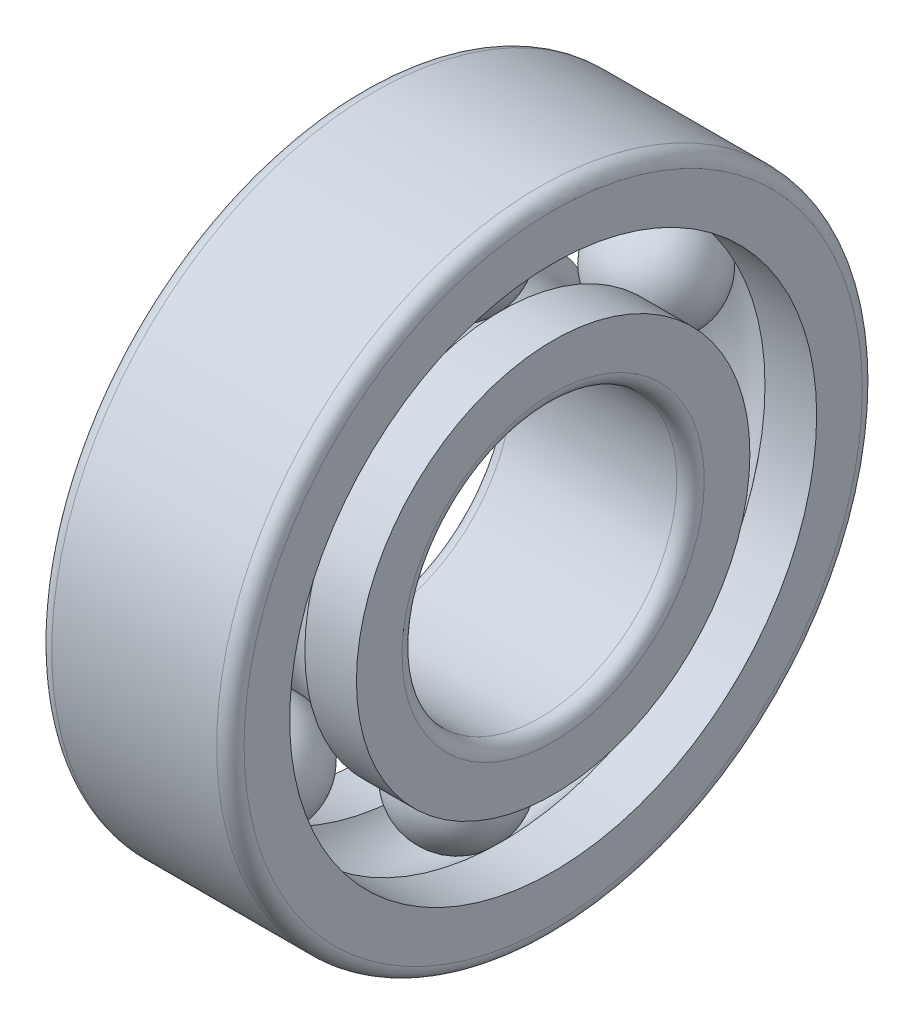
ISO-10303-21;
HEADER;
FILE_DESCRIPTION(('STEP AP214'),'2;1');
FILE_NAME('part.step','',(''),(''),'','','');
FILE_SCHEMA(('AUTOMOTIVE_DESIGN { 1 0 10303 214 1 1 1 1 }'));
ENDSEC;
DATA;
#1=APPLICATION_CONTEXT('core data for automotive mechanical design processes');
#2=APPLICATION_PROTOCOL_DEFINITION('international standard','automotive_design',2000,#1);
#3=PRODUCT_CONTEXT('',#1,'mechanical');
#4=PRODUCT('Part','Part','',(#3));
#5=PRODUCT_RELATED_PRODUCT_CATEGORY('part','',(#4));
#6=PRODUCT_DEFINITION_FORMATION('','',#4);
#7=PRODUCT_DEFINITION_CONTEXT('part definition',#1,'design');
#8=PRODUCT_DEFINITION('design','',#6,#7);
#9=PRODUCT_DEFINITION_SHAPE('','',#8);
#10=(LENGTH_UNIT() NAMED_UNIT(*) SI_UNIT(.MILLI.,.METRE.));
#11=(NAMED_UNIT(*) PLANE_ANGLE_UNIT() SI_UNIT($,.RADIAN.));
#12=(NAMED_UNIT(*) SI_UNIT($,.STERADIAN.) SOLID_ANGLE_UNIT());
#13=UNCERTAINTY_MEASURE_WITH_UNIT(LENGTH_MEASURE(1.E-05),#10,'distance_accuracy_value','');
#14=(GEOMETRIC_REPRESENTATION_CONTEXT(3) GLOBAL_UNCERTAINTY_ASSIGNED_CONTEXT((#13)) GLOBAL_UNIT_ASSIGNED_CONTEXT((#10,
#11,#12)) REPRESENTATION_CONTEXT('',''));
#15=CARTESIAN_POINT('',(0.,0.,0.));
#16=DIRECTION('',(0.,0.,1.));
#17=DIRECTION('',(1.,0.,0.));
#18=AXIS2_PLACEMENT_3D('',#15,#16,#17);
#19=CARTESIAN_POINT('',(7.,8.375,14.5059255133893));
#20=DIRECTION('',(1.,0.,0.));
#21=DIRECTION('',(0.,0.5,0.866025403784439));
#22=AXIS2_PLACEMENT_3D('',#19,#20,#21);
#23=SPHERICAL_SURFACE('',#22,4.05);
#24=CARTESIAN_POINT('',(2.95,8.375,14.5059255133893));
#25=VERTEX_POINT('',#24);
#26=VERTEX_LOOP('',#25);
#27=FACE_BOUND('',#26,.T.);
#28=CARTESIAN_POINT('',(11.05,8.375,14.5059255133893));
#29=VERTEX_POINT('',#28);
#30=VERTEX_LOOP('',#29);
#31=FACE_BOUND('',#30,.T.);
#32=ADVANCED_FACE('P0_F16',(#27,#31),#23,.T.);
#33=OPEN_SHELL('',(#32));
#34=SHELL_BASED_SURFACE_MODEL('P0_B1',(#33));
#35=CARTESIAN_POINT('',(7.,-16.75,0.));
#36=DIRECTION('',(1.,0.,0.));
#37=DIRECTION('',(0.,-1.,0.));
#38=AXIS2_PLACEMENT_3D('',#35,#36,#37);
#39=SPHERICAL_SURFACE('',#38,4.05);
#40=CARTESIAN_POINT('',(2.95,-16.75,0.));
#41=VERTEX_POINT('',#40);
#42=VERTEX_LOOP('',#41);
#43=FACE_BOUND('',#42,.T.);
#44=CARTESIAN_POINT('',(11.05,-16.75,0.));
#45=VERTEX_POINT('',#44);
#46=VERTEX_LOOP('',#45);
#47=FACE_BOUND('',#46,.T.);
#48=ADVANCED_FACE('P1_F16',(#43,#47),#39,.T.);
#49=OPEN_SHELL('',(#48));
#50=SHELL_BASED_SURFACE_MODEL('P1_B1',(#49));
#51=CARTESIAN_POINT('',(7.,-8.37500000000001,-14.5059255133893));
#52=DIRECTION('',(1.,0.,0.));
#53=DIRECTION('',(0.,-0.5,-0.866025403784438));
#54=AXIS2_PLACEMENT_3D('',#51,#52,#53);
#55=SPHERICAL_SURFACE('',#54,4.05);
#56=CARTESIAN_POINT('',(2.95,-8.37500000000001,-14.5059255133893));
#57=VERTEX_POINT('',#56);
#58=VERTEX_LOOP('',#57);
#59=FACE_BOUND('',#58,.T.);
#60=CARTESIAN_POINT('',(11.05,-8.37500000000001,-14.5059255133893));
#61=VERTEX_POINT('',#60);
#62=VERTEX_LOOP('',#61);
#63=FACE_BOUND('',#62,.T.);
#64=ADVANCED_FACE('P2_F16',(#59,#63),#55,.T.);
#65=OPEN_SHELL('',(#64));
#66=SHELL_BASED_SURFACE_MODEL('P2_B1',(#65));
#67=CARTESIAN_POINT('',(7.,16.75,0.));
#68=DIRECTION('',(1.,0.,0.));
#69=DIRECTION('',(0.,1.,0.));
#70=AXIS2_PLACEMENT_3D('',#67,#68,#69);
#71=SPHERICAL_SURFACE('',#70,4.05);
#72=CARTESIAN_POINT('',(2.95,16.75,0.));
#73=VERTEX_POINT('',#72);
#74=VERTEX_LOOP('',#73);
#75=FACE_BOUND('',#74,.T.);
#76=CARTESIAN_POINT('',(11.05,16.75,0.));
#77=VERTEX_POINT('',#76);
#78=VERTEX_LOOP('',#77);
#79=FACE_BOUND('',#78,.T.);
#80=ADVANCED_FACE('P3_F16',(#75,#79),#71,.T.);
#81=OPEN_SHELL('',(#80));
#82=SHELL_BASED_SURFACE_MODEL('P3_B1',(#81));
#83=CARTESIAN_POINT('',(7.,8.37499999999999,-14.5059255133894));
#84=DIRECTION('',(1.,0.,0.));
#85=DIRECTION('',(0.,0.5,-0.866025403784439));
#86=AXIS2_PLACEMENT_3D('',#83,#84,#85);
#87=SPHERICAL_SURFACE('',#86,4.05);
#88=CARTESIAN_POINT('',(2.95,8.37499999999999,-14.5059255133894));
#89=VERTEX_POINT('',#88);
#90=VERTEX_LOOP('',#89);
#91=FACE_BOUND('',#90,.T.);
#92=CARTESIAN_POINT('',(11.05,8.37499999999999,-14.5059255133894));
#93=VERTEX_POINT('',#92);
#94=VERTEX_LOOP('',#93);
#95=FACE_BOUND('',#94,.T.);
#96=ADVANCED_FACE('P4_F16',(#91,#95),#87,.T.);
#97=OPEN_SHELL('',(#96));
#98=SHELL_BASED_SURFACE_MODEL('P4_B1',(#97));
#99=CARTESIAN_POINT('',(7.,-8.375,14.5059255133894));
#100=DIRECTION('',(1.,0.,0.));
#101=DIRECTION('',(0.,-0.5,0.866025403784439));
#102=AXIS2_PLACEMENT_3D('',#99,#100,#101);
#103=SPHERICAL_SURFACE('',#102,4.05);
#104=CARTESIAN_POINT('',(2.95,-8.375,14.5059255133894));
#105=VERTEX_POINT('',#104);
#106=VERTEX_LOOP('',#105);
#107=FACE_BOUND('',#106,.T.);
#108=CARTESIAN_POINT('',(11.05,-8.375,14.5059255133894));
#109=VERTEX_POINT('',#108);
#110=VERTEX_LOOP('',#109);
#111=FACE_BOUND('',#110,.T.);
#112=ADVANCED_FACE('P5_F16',(#107,#111),#103,.T.);
#113=OPEN_SHELL('',(#112));
#114=SHELL_BASED_SURFACE_MODEL('P5_B1',(#113));
#115=CARTESIAN_POINT('',(7.,0.,0.));
#116=DIRECTION('',(1.,0.,0.));
#117=DIRECTION('',(0.,0.,-1.));
#118=AXIS2_PLACEMENT_3D('',#115,#116,#117);
#119=TOROIDAL_SURFACE('',#118,16.75,4.05);
#120=CARTESIAN_POINT('',(3.76,0.,0.));
#121=DIRECTION('',(1.,0.,0.));
#122=DIRECTION('',(0.,0.,-1.));
#123=AXIS2_PLACEMENT_3D('',#120,#121,#122);
#124=CIRCLE('',#123,14.32);
#125=CARTESIAN_POINT('',(3.76,0.,-14.32));
#126=VERTEX_POINT('',#125);
#127=EDGE_CURVE('P6_E110',#126,#126,#124,.F.);
#128=ORIENTED_EDGE('',*,*,#127,.F.);
#129=EDGE_LOOP('',(#128));
#130=FACE_BOUND('',#129,.T.);
#131=CARTESIAN_POINT('',(10.24,0.,0.));
#132=DIRECTION('',(1.,0.,0.));
#133=DIRECTION('',(0.,0.,-1.));
#134=AXIS2_PLACEMENT_3D('',#131,#132,#133);
#135=CIRCLE('',#134,14.32);
#136=CARTESIAN_POINT('',(10.24,0.,-14.32));
#137=VERTEX_POINT('',#136);
#138=EDGE_CURVE('P6_E113',#137,#137,#135,.T.);
#139=ORIENTED_EDGE('',*,*,#138,.F.);
#140=EDGE_LOOP('',(#139));
#141=FACE_BOUND('',#140,.T.);
#142=ADVANCED_FACE('P6_F15',(#130,#141),#119,.F.);
#143=CARTESIAN_POINT('',(12.12,0.,0.));
#144=DIRECTION('',(1.,0.,0.));
#145=DIRECTION('',(0.,0.,-1.));
#146=AXIS2_PLACEMENT_3D('',#143,#144,#145);
#147=CYLINDRICAL_SURFACE('',#146,14.32);
#148=ORIENTED_EDGE('',*,*,#138,.T.);
#149=EDGE_LOOP('',(#148));
#150=FACE_BOUND('',#149,.T.);
#151=CARTESIAN_POINT('',(14.,0.,0.));
#152=DIRECTION('',(1.,0.,0.));
#153=DIRECTION('',(0.,0.,-1.));
#154=AXIS2_PLACEMENT_3D('',#151,#152,#153);
#155=CIRCLE('',#154,14.32);
#156=CARTESIAN_POINT('',(14.,0.,-14.32));
#157=VERTEX_POINT('',#156);
#158=EDGE_CURVE('P6_E19',#157,#157,#155,.T.);
#159=ORIENTED_EDGE('',*,*,#158,.F.);
#160=EDGE_LOOP('',(#159));
#161=FACE_BOUND('',#160,.T.);
#162=ADVANCED_FACE('P6_F85',(#150,#161),#147,.T.);
#163=CARTESIAN_POINT('',(1.88,0.,0.));
#164=DIRECTION('',(1.,0.,0.));
#165=DIRECTION('',(0.,0.,-1.));
#166=AXIS2_PLACEMENT_3D('',#163,#164,#165);
#167=CYLINDRICAL_SURFACE('',#166,14.32);
#168=CARTESIAN_POINT('',(0.,0.,0.));
#169=DIRECTION('',(1.,0.,0.));
#170=DIRECTION('',(0.,0.,-1.));
#171=AXIS2_PLACEMENT_3D('',#168,#169,#170);
#172=CIRCLE('',#171,14.32);
#173=CARTESIAN_POINT('',(0.,0.,-14.32));
#174=VERTEX_POINT('',#173);
#175=EDGE_CURVE('P6_E105',#174,#174,#172,.F.);
#176=ORIENTED_EDGE('',*,*,#175,.F.);
#177=EDGE_LOOP('',(#176));
#178=FACE_BOUND('',#177,.T.);
#179=ORIENTED_EDGE('',*,*,#127,.T.);
#180=EDGE_LOOP('',(#179));
#181=FACE_BOUND('',#180,.T.);
#182=ADVANCED_FACE('P6_F82',(#178,#181),#167,.T.);
#183=CARTESIAN_POINT('',(14.,12.16,0.));
#184=DIRECTION('',(1.,0.,0.));
#185=DIRECTION('',(0.,0.,-1.));
#186=AXIS2_PLACEMENT_3D('',#183,#184,#185);
#187=PLANE('',#186);
#188=CARTESIAN_POINT('',(14.,0.,0.));
#189=DIRECTION('',(1.,0.,0.));
#190=DIRECTION('',(0.,1.,0.));
#191=AXIS2_PLACEMENT_3D('',#188,#189,#190);
#192=CIRCLE('',#191,11.);
#193=CARTESIAN_POINT('',(14.,11.,0.));
#194=VERTEX_POINT('',#193);
#195=EDGE_CURVE('P6_E66',#194,#194,#192,.T.);
#196=ORIENTED_EDGE('',*,*,#195,.F.);
#197=EDGE_LOOP('',(#196));
#198=FACE_BOUND('',#197,.T.);
#199=ORIENTED_EDGE('',*,*,#158,.T.);
#200=EDGE_LOOP('',(#199));
#201=FACE_BOUND('',#200,.T.);
#202=ADVANCED_FACE('P6_F72',(#198,#201),#187,.T.);
#203=CARTESIAN_POINT('',(0.,12.16,0.));
#204=DIRECTION('',(-1.,0.,0.));
#205=DIRECTION('',(0.,0.,1.));
#206=AXIS2_PLACEMENT_3D('',#203,#204,#205);
#207=PLANE('',#206);
#208=CARTESIAN_POINT('',(0.,0.,0.));
#209=DIRECTION('',(-1.,0.,0.));
#210=DIRECTION('',(0.,1.,0.));
#211=AXIS2_PLACEMENT_3D('',#208,#209,#210);
#212=CIRCLE('',#211,11.);
#213=CARTESIAN_POINT('',(0.,11.,0.));
#214=VERTEX_POINT('',#213);
#215=EDGE_CURVE('P6_E28',#214,#214,#212,.T.);
#216=ORIENTED_EDGE('',*,*,#215,.F.);
#217=EDGE_LOOP('',(#216));
#218=FACE_BOUND('',#217,.T.);
#219=ORIENTED_EDGE('',*,*,#175,.T.);
#220=EDGE_LOOP('',(#219));
#221=FACE_BOUND('',#220,.T.);
#222=ADVANCED_FACE('P6_F81',(#218,#221),#207,.T.);
#223=CARTESIAN_POINT('',(13.,0.,0.));
#224=DIRECTION('',(1.,0.,0.));
#225=DIRECTION('',(0.,0.,-1.));
#226=AXIS2_PLACEMENT_3D('',#223,#224,#225);
#227=TOROIDAL_SURFACE('',#226,11.,1.);
#228=CARTESIAN_POINT('',(13.,0.,0.));
#229=DIRECTION('',(1.,0.,0.));
#230=DIRECTION('',(0.,0.,-1.));
#231=AXIS2_PLACEMENT_3D('',#228,#229,#230);
#232=CIRCLE('',#231,10.);
#233=CARTESIAN_POINT('',(13.,0.,-10.));
#234=VERTEX_POINT('',#233);
#235=EDGE_CURVE('P6_E23',#234,#234,#232,.F.);
#236=ORIENTED_EDGE('',*,*,#235,.T.);
#237=EDGE_LOOP('',(#236));
#238=FACE_BOUND('',#237,.T.);
#239=ORIENTED_EDGE('',*,*,#195,.T.);
#240=EDGE_LOOP('',(#239));
#241=FACE_BOUND('',#240,.T.);
#242=ADVANCED_FACE('P6_F46',(#238,#241),#227,.T.);
#243=CARTESIAN_POINT('',(1.,0.,0.));
#244=DIRECTION('',(1.,0.,0.));
#245=DIRECTION('',(0.,0.,-1.));
#246=AXIS2_PLACEMENT_3D('',#243,#244,#245);
#247=TOROIDAL_SURFACE('',#246,11.,1.);
#248=ORIENTED_EDGE('',*,*,#215,.T.);
#249=EDGE_LOOP('',(#248));
#250=FACE_BOUND('',#249,.T.);
#251=CARTESIAN_POINT('',(1.,0.,0.));
#252=DIRECTION('',(1.,0.,0.));
#253=DIRECTION('',(0.,0.,-1.));
#254=AXIS2_PLACEMENT_3D('',#251,#252,#253);
#255=CIRCLE('',#254,10.);
#256=CARTESIAN_POINT('',(1.,0.,-10.));
#257=VERTEX_POINT('',#256);
#258=EDGE_CURVE('P6_E10',#257,#257,#255,.T.);
#259=ORIENTED_EDGE('',*,*,#258,.T.);
#260=EDGE_LOOP('',(#259));
#261=FACE_BOUND('',#260,.T.);
#262=ADVANCED_FACE('P6_F40',(#250,#261),#247,.T.);
#263=CARTESIAN_POINT('',(7.,0.,0.));
#264=DIRECTION('',(1.,0.,0.));
#265=DIRECTION('',(0.,0.,-1.));
#266=AXIS2_PLACEMENT_3D('',#263,#264,#265);
#267=CYLINDRICAL_SURFACE('',#266,10.);
#268=ORIENTED_EDGE('',*,*,#258,.F.);
#269=EDGE_LOOP('',(#268));
#270=FACE_BOUND('',#269,.T.);
#271=ORIENTED_EDGE('',*,*,#235,.F.);
#272=EDGE_LOOP('',(#271));
#273=FACE_BOUND('',#272,.T.);
#274=ADVANCED_FACE('P6_F45',(#270,#273),#267,.F.);
#275=CLOSED_SHELL('',(#142,#162,#182,#202,#222,#242,#262,#274));
#276=MANIFOLD_SOLID_BREP('P6_B1',#275);
#277=CARTESIAN_POINT('',(7.,0.,0.));
#278=DIRECTION('',(1.,0.,0.));
#279=DIRECTION('',(0.,0.,-1.));
#280=AXIS2_PLACEMENT_3D('',#277,#278,#279);
#281=TOROIDAL_SURFACE('',#280,16.75,4.05);
#282=CARTESIAN_POINT('',(3.76,0.,0.));
#283=DIRECTION('',(1.,0.,0.));
#284=DIRECTION('',(0.,0.,-1.));
#285=AXIS2_PLACEMENT_3D('',#282,#283,#284);
#286=CIRCLE('',#285,19.18);
#287=CARTESIAN_POINT('',(3.76,0.,-19.18));
#288=VERTEX_POINT('',#287);
#289=EDGE_CURVE('P7_E113',#288,#288,#286,.F.);
#290=ORIENTED_EDGE('',*,*,#289,.T.);
#291=EDGE_LOOP('',(#290));
#292=FACE_BOUND('',#291,.T.);
#293=CARTESIAN_POINT('',(10.24,0.,0.));
#294=DIRECTION('',(1.,0.,0.));
#295=DIRECTION('',(0.,0.,-1.));
#296=AXIS2_PLACEMENT_3D('',#293,#294,#295);
#297=CIRCLE('',#296,19.18);
#298=CARTESIAN_POINT('',(10.24,0.,-19.18));
#299=VERTEX_POINT('',#298);
#300=EDGE_CURVE('P7_E110',#299,#299,#297,.T.);
#301=ORIENTED_EDGE('',*,*,#300,.T.);
#302=EDGE_LOOP('',(#301));
#303=FACE_BOUND('',#302,.T.);
#304=ADVANCED_FACE('P7_F15',(#292,#303),#281,.F.);
#305=CARTESIAN_POINT('',(1.88,0.,0.));
#306=DIRECTION('',(1.,0.,0.));
#307=DIRECTION('',(0.,0.,-1.));
#308=AXIS2_PLACEMENT_3D('',#305,#306,#307);
#309=CYLINDRICAL_SURFACE('',#308,19.18);
#310=ORIENTED_EDGE('',*,*,#289,.F.);
#311=EDGE_LOOP('',(#310));
#312=FACE_BOUND('',#311,.T.);
#313=CARTESIAN_POINT('',(0.,0.,0.));
#314=DIRECTION('',(1.,0.,0.));
#315=DIRECTION('',(0.,0.,-1.));
#316=AXIS2_PLACEMENT_3D('',#313,#314,#315);
#317=CIRCLE('',#316,19.18);
#318=CARTESIAN_POINT('',(0.,0.,-19.18));
#319=VERTEX_POINT('',#318);
#320=EDGE_CURVE('P7_E19',#319,#319,#317,.T.);
#321=ORIENTED_EDGE('',*,*,#320,.F.);
#322=EDGE_LOOP('',(#321));
#323=FACE_BOUND('',#322,.T.);
#324=ADVANCED_FACE('P7_F86',(#312,#323),#309,.F.);
#325=CARTESIAN_POINT('',(12.12,0.,0.));
#326=DIRECTION('',(1.,0.,0.));
#327=DIRECTION('',(0.,0.,-1.));
#328=AXIS2_PLACEMENT_3D('',#325,#326,#327);
#329=CYLINDRICAL_SURFACE('',#328,19.18);
#330=CARTESIAN_POINT('',(14.,0.,0.));
#331=DIRECTION('',(1.,0.,0.));
#332=DIRECTION('',(0.,0.,-1.));
#333=AXIS2_PLACEMENT_3D('',#330,#331,#332);
#334=CIRCLE('',#333,19.18);
#335=CARTESIAN_POINT('',(14.,0.,-19.18));
#336=VERTEX_POINT('',#335);
#337=EDGE_CURVE('P7_E105',#336,#336,#334,.F.);
#338=ORIENTED_EDGE('',*,*,#337,.F.);
#339=EDGE_LOOP('',(#338));
#340=FACE_BOUND('',#339,.T.);
#341=ORIENTED_EDGE('',*,*,#300,.F.);
#342=EDGE_LOOP('',(#341));
#343=FACE_BOUND('',#342,.T.);
#344=ADVANCED_FACE('P7_F82',(#340,#343),#329,.F.);
#345=CARTESIAN_POINT('',(0.,21.34,0.));
#346=DIRECTION('',(-1.,0.,0.));
#347=DIRECTION('',(0.,0.,1.));
#348=AXIS2_PLACEMENT_3D('',#345,#346,#347);
#349=PLANE('',#348);
#350=ORIENTED_EDGE('',*,*,#320,.T.);
#351=EDGE_LOOP('',(#350));
#352=FACE_BOUND('',#351,.T.);
#353=CARTESIAN_POINT('',(0.,0.,0.));
#354=DIRECTION('',(1.,0.,0.));
#355=DIRECTION('',(0.,1.,0.));
#356=AXIS2_PLACEMENT_3D('',#353,#354,#355);
#357=CIRCLE('',#356,22.5);
#358=CARTESIAN_POINT('',(0.,22.5,0.));
#359=VERTEX_POINT('',#358);
#360=EDGE_CURVE('P7_E66',#359,#359,#357,.T.);
#361=ORIENTED_EDGE('',*,*,#360,.F.);
#362=EDGE_LOOP('',(#361));
#363=FACE_BOUND('',#362,.T.);
#364=ADVANCED_FACE('P7_F72',(#352,#363),#349,.T.);
#365=CARTESIAN_POINT('',(14.,21.34,0.));
#366=DIRECTION('',(1.,0.,0.));
#367=DIRECTION('',(0.,0.,-1.));
#368=AXIS2_PLACEMENT_3D('',#365,#366,#367);
#369=PLANE('',#368);
#370=ORIENTED_EDGE('',*,*,#337,.T.);
#371=EDGE_LOOP('',(#370));
#372=FACE_BOUND('',#371,.T.);
#373=CARTESIAN_POINT('',(14.,0.,0.));
#374=DIRECTION('',(-1.,0.,0.));
#375=DIRECTION('',(0.,1.,0.));
#376=AXIS2_PLACEMENT_3D('',#373,#374,#375);
#377=CIRCLE('',#376,22.5);
#378=CARTESIAN_POINT('',(14.,22.5,0.));
#379=VERTEX_POINT('',#378);
#380=EDGE_CURVE('P7_E28',#379,#379,#377,.T.);
#381=ORIENTED_EDGE('',*,*,#380,.F.);
#382=EDGE_LOOP('',(#381));
#383=FACE_BOUND('',#382,.T.);
#384=ADVANCED_FACE('P7_F81',(#372,#383),#369,.T.);
#385=CARTESIAN_POINT('',(0.999999999999998,0.,0.));
#386=DIRECTION('',(1.,0.,0.));
#387=DIRECTION('',(0.,0.,-1.));
#388=AXIS2_PLACEMENT_3D('',#385,#386,#387);
#389=TOROIDAL_SURFACE('',#388,22.5,1.);
#390=CARTESIAN_POINT('',(0.999999999999998,0.,0.));
#391=DIRECTION('',(1.,0.,0.));
#392=DIRECTION('',(0.,0.,-1.));
#393=AXIS2_PLACEMENT_3D('',#390,#391,#392);
#394=CIRCLE('',#393,23.5);
#395=CARTESIAN_POINT('',(0.999999999999998,0.,-23.5));
#396=VERTEX_POINT('',#395);
#397=EDGE_CURVE('P7_E23',#396,#396,#394,.T.);
#398=ORIENTED_EDGE('',*,*,#397,.F.);
#399=EDGE_LOOP('',(#398));
#400=FACE_BOUND('',#399,.T.);
#401=ORIENTED_EDGE('',*,*,#360,.T.);
#402=EDGE_LOOP('',(#401));
#403=FACE_BOUND('',#402,.T.);
#404=ADVANCED_FACE('P7_F46',(#400,#403),#389,.T.);
#405=CARTESIAN_POINT('',(13.,0.,0.));
#406=DIRECTION('',(1.,0.,0.));
#407=DIRECTION('',(0.,0.,-1.));
#408=AXIS2_PLACEMENT_3D('',#405,#406,#407);
#409=TOROIDAL_SURFACE('',#408,22.5,1.);
#410=ORIENTED_EDGE('',*,*,#380,.T.);
#411=EDGE_LOOP('',(#410));
#412=FACE_BOUND('',#411,.T.);
#413=CARTESIAN_POINT('',(13.,0.,0.));
#414=DIRECTION('',(1.,0.,0.));
#415=DIRECTION('',(0.,0.,-1.));
#416=AXIS2_PLACEMENT_3D('',#413,#414,#415);
#417=CIRCLE('',#416,23.5);
#418=CARTESIAN_POINT('',(13.,0.,-23.5));
#419=VERTEX_POINT('',#418);
#420=EDGE_CURVE('P7_E10',#419,#419,#417,.F.);
#421=ORIENTED_EDGE('',*,*,#420,.F.);
#422=EDGE_LOOP('',(#421));
#423=FACE_BOUND('',#422,.T.);
#424=ADVANCED_FACE('P7_F40',(#412,#423),#409,.T.);
#425=CARTESIAN_POINT('',(7.,0.,0.));
#426=DIRECTION('',(1.,0.,0.));
#427=DIRECTION('',(0.,0.,-1.));
#428=AXIS2_PLACEMENT_3D('',#425,#426,#427);
#429=CYLINDRICAL_SURFACE('',#428,23.5);
#430=ORIENTED_EDGE('',*,*,#420,.T.);
#431=EDGE_LOOP('',(#430));
#432=FACE_BOUND('',#431,.T.);
#433=ORIENTED_EDGE('',*,*,#397,.T.);
#434=EDGE_LOOP('',(#433));
#435=FACE_BOUND('',#434,.T.);
#436=ADVANCED_FACE('P7_F45',(#432,#435),#429,.T.);
#437=CLOSED_SHELL('',(#304,#324,#344,#364,#384,#404,#424,#436));
#438=MANIFOLD_SOLID_BREP('P7_B1',#437);
#439=ADVANCED_BREP_SHAPE_REPRESENTATION('',(#18,#276,#438),#14);
#440=MANIFOLD_SURFACE_SHAPE_REPRESENTATION('',(#18,#34,#50,#66,#82,#98,#114),#14);
#441=SHAPE_REPRESENTATION('',(#18),#14);
#442=SHAPE_DEFINITION_REPRESENTATION(#9,#441);
#443=SHAPE_REPRESENTATION_RELATIONSHIP('','',#441,#439);
#444=SHAPE_REPRESENTATION_RELATIONSHIP('','',#441,#440);
ENDSEC;
END-ISO-10303-21;
